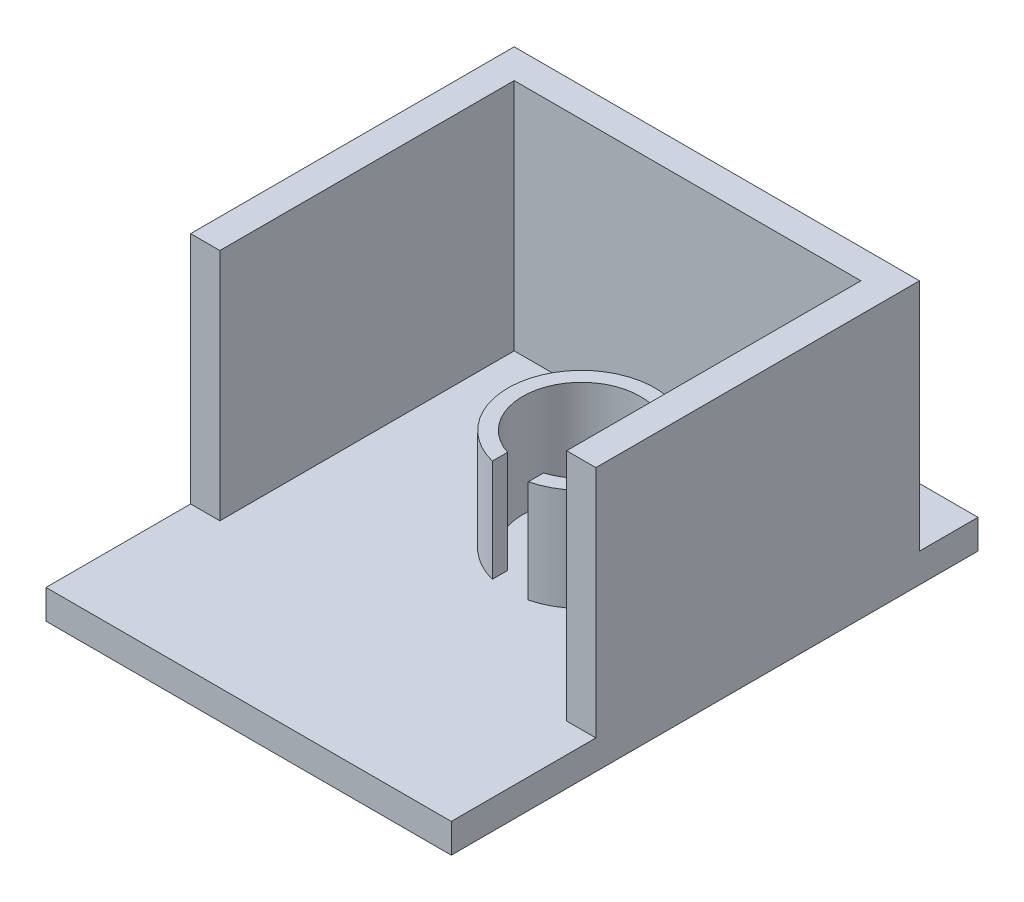
ISO-10303-21;
HEADER;
FILE_DESCRIPTION(('STEP AP214'),'2;1');
FILE_NAME('part.step','',(''),(''),'','','');
FILE_SCHEMA(('AUTOMOTIVE_DESIGN { 1 0 10303 214 1 1 1 1 }'));
ENDSEC;
DATA;
#1=APPLICATION_CONTEXT('core data for automotive mechanical design processes');
#2=APPLICATION_PROTOCOL_DEFINITION('international standard','automotive_design',2000,#1);
#3=PRODUCT_CONTEXT('',#1,'mechanical');
#4=PRODUCT('Part','Part','',(#3));
#5=PRODUCT_RELATED_PRODUCT_CATEGORY('part','',(#4));
#6=PRODUCT_DEFINITION_FORMATION('','',#4);
#7=PRODUCT_DEFINITION_CONTEXT('part definition',#1,'design');
#8=PRODUCT_DEFINITION('design','',#6,#7);
#9=PRODUCT_DEFINITION_SHAPE('','',#8);
#10=(LENGTH_UNIT() NAMED_UNIT(*) SI_UNIT(.MILLI.,.METRE.));
#11=(NAMED_UNIT(*) PLANE_ANGLE_UNIT() SI_UNIT($,.RADIAN.));
#12=(NAMED_UNIT(*) SI_UNIT($,.STERADIAN.) SOLID_ANGLE_UNIT());
#13=UNCERTAINTY_MEASURE_WITH_UNIT(LENGTH_MEASURE(1.E-05),#10,'distance_accuracy_value','');
#14=(GEOMETRIC_REPRESENTATION_CONTEXT(3) GLOBAL_UNCERTAINTY_ASSIGNED_CONTEXT((#13)) GLOBAL_UNIT_ASSIGNED_CONTEXT((#10,
#11,#12)) REPRESENTATION_CONTEXT('',''));
#15=CARTESIAN_POINT('',(0.,0.,0.));
#16=DIRECTION('',(0.,0.,1.));
#17=DIRECTION('',(1.,0.,0.));
#18=AXIS2_PLACEMENT_3D('',#15,#16,#17);
#19=CARTESIAN_POINT('',(0.,5.,0.));
#20=DIRECTION('',(0.,-1.,0.));
#21=DIRECTION('',(0.,0.,-1.));
#22=AXIS2_PLACEMENT_3D('',#19,#20,#21);
#23=PLANE('',#22);
#24=CARTESIAN_POINT('',(0.,5.,-23.));
#25=DIRECTION('',(0.,-1.,0.));
#26=DIRECTION('',(0.,0.,1.));
#27=AXIS2_PLACEMENT_3D('',#24,#25,#26);
#28=CIRCLE('',#27,20.1);
#29=CARTESIAN_POINT('',(-6.13516684592346,5.,-3.85921297927691));
#30=VERTEX_POINT('',#29);
#31=CARTESIAN_POINT('',(6.13516684592346,5.,-3.85921297927691));
#32=VERTEX_POINT('',#31);
#33=EDGE_CURVE('E204',#30,#32,#28,.T.);
#34=ORIENTED_EDGE('',*,*,#33,.F.);
#35=DIRECTION('',(0.,0.,-1.));
#36=VECTOR('',#35,1.);
#37=CARTESIAN_POINT('',(-6.13516684592346,5.,-3.85921297927691));
#38=LINE('',#37,#36);
#39=CARTESIAN_POINT('',(-6.13516684592346,5.,1.33864679419712));
#40=VERTEX_POINT('',#39);
#41=EDGE_CURVE('E194',#40,#30,#38,.T.);
#42=ORIENTED_EDGE('',*,*,#41,.F.);
#43=CARTESIAN_POINT('',(0.,5.,-23.));
#44=DIRECTION('',(0.,1.,0.));
#45=DIRECTION('',(0.,0.,1.));
#46=AXIS2_PLACEMENT_3D('',#43,#44,#45);
#47=CIRCLE('',#46,25.1);
#48=CARTESIAN_POINT('',(6.13516684592346,5.,1.33864679419712));
#49=VERTEX_POINT('',#48);
#50=EDGE_CURVE('E198',#49,#40,#47,.T.);
#51=ORIENTED_EDGE('',*,*,#50,.F.);
#52=DIRECTION('',(0.,0.,1.));
#53=VECTOR('',#52,1.);
#54=CARTESIAN_POINT('',(6.13516684592346,5.,-3.85921297927691));
#55=LINE('',#54,#53);
#56=EDGE_CURVE('E201',#32,#49,#55,.T.);
#57=ORIENTED_EDGE('',*,*,#56,.F.);
#58=EDGE_LOOP('',(#34,#42,#51,#57));
#59=FACE_BOUND('',#58,.T.);
#60=DIRECTION('',(1.,0.,0.));
#61=VECTOR('',#60,1.);
#62=CARTESIAN_POINT('',(-80.,5.,80.));
#63=LINE('',#62,#61);
#64=CARTESIAN_POINT('',(-80.,5.,80.));
#65=VERTEX_POINT('',#64);
#66=CARTESIAN_POINT('',(58.5,5.,80.));
#67=VERTEX_POINT('',#66);
#68=EDGE_CURVE('E176',#65,#67,#63,.T.);
#69=ORIENTED_EDGE('',*,*,#68,.T.);
#70=DIRECTION('',(0.,0.,1.));
#71=VECTOR('',#70,1.);
#72=CARTESIAN_POINT('',(58.5,5.,80.));
#73=LINE('',#72,#71);
#74=CARTESIAN_POINT('',(58.5,5.,30.5810382555309));
#75=VERTEX_POINT('',#74);
#76=EDGE_CURVE('E153',#75,#67,#73,.T.);
#77=ORIENTED_EDGE('',*,*,#76,.F.);
#78=DIRECTION('',(1.,0.,0.));
#79=VECTOR('',#78,1.);
#80=CARTESIAN_POINT('',(48.5,5.,30.5810382555309));
#81=LINE('',#80,#79);
#82=CARTESIAN_POINT('',(48.5,5.,30.5810382555309));
#83=VERTEX_POINT('',#82);
#84=EDGE_CURVE('E62',#83,#75,#81,.T.);
#85=ORIENTED_EDGE('',*,*,#84,.F.);
#86=DIRECTION('',(0.,0.,1.));
#87=VECTOR('',#86,1.);
#88=CARTESIAN_POINT('',(48.5,5.,-25.8269662482818));
#89=LINE('',#88,#87);
#90=CARTESIAN_POINT('',(48.5,5.,-70.));
#91=VERTEX_POINT('',#90);
#92=EDGE_CURVE('E243',#91,#83,#89,.T.);
#93=ORIENTED_EDGE('',*,*,#92,.F.);
#94=DIRECTION('',(1.,0.,0.));
#95=VECTOR('',#94,1.);
#96=CARTESIAN_POINT('',(-70.,5.,-70.));
#97=LINE('',#96,#95);
#98=CARTESIAN_POINT('',(-70.,5.,-70.));
#99=VERTEX_POINT('',#98);
#100=EDGE_CURVE('E245',#99,#91,#97,.T.);
#101=ORIENTED_EDGE('',*,*,#100,.F.);
#102=DIRECTION('',(0.,0.,-1.));
#103=VECTOR('',#102,1.);
#104=CARTESIAN_POINT('',(-70.,5.,-70.));
#105=LINE('',#104,#103);
#106=CARTESIAN_POINT('',(-70.,5.,30.5810382555309));
#107=VERTEX_POINT('',#106);
#108=EDGE_CURVE('E235',#107,#99,#105,.T.);
#109=ORIENTED_EDGE('',*,*,#108,.F.);
#110=DIRECTION('',(1.,0.,0.));
#111=VECTOR('',#110,1.);
#112=CARTESIAN_POINT('',(-70.,5.,30.5810382555309));
#113=LINE('',#112,#111);
#114=CARTESIAN_POINT('',(-80.,5.,30.5810382555309));
#115=VERTEX_POINT('',#114);
#116=EDGE_CURVE('E239',#115,#107,#113,.T.);
#117=ORIENTED_EDGE('',*,*,#116,.F.);
#118=DIRECTION('',(0.,0.,1.));
#119=VECTOR('',#118,1.);
#120=CARTESIAN_POINT('',(-80.,5.,80.));
#121=LINE('',#120,#119);
#122=EDGE_CURVE('E173',#115,#65,#121,.T.);
#123=ORIENTED_EDGE('',*,*,#122,.T.);
#124=EDGE_LOOP('',(#69,#77,#85,#93,#101,#109,#117,#123));
#125=FACE_BOUND('',#124,.T.);
#126=ADVANCED_FACE('F39',(#59,#125),#23,.F.);
#127=CARTESIAN_POINT('',(-80.,5.,-80.));
#128=DIRECTION('',(0.,0.,1.));
#129=DIRECTION('',(1.,0.,0.));
#130=AXIS2_PLACEMENT_3D('',#127,#128,#129);
#131=PLANE('',#130);
#132=DIRECTION('',(1.,0.,0.));
#133=VECTOR('',#132,1.);
#134=CARTESIAN_POINT('',(80.,5.,-80.));
#135=LINE('',#134,#133);
#136=CARTESIAN_POINT('',(-80.,5.,-80.));
#137=VERTEX_POINT('',#136);
#138=CARTESIAN_POINT('',(58.5,5.,-79.9999999999999));
#139=VERTEX_POINT('',#138);
#140=EDGE_CURVE('E158',#137,#139,#135,.T.);
#141=ORIENTED_EDGE('',*,*,#140,.F.);
#142=DIRECTION('',(0.,-1.,0.));
#143=VECTOR('',#142,1.);
#144=CARTESIAN_POINT('',(-80.,5.,-80.));
#145=LINE('',#144,#143);
#146=CARTESIAN_POINT('',(-80.,85.,-80.));
#147=VERTEX_POINT('',#146);
#148=EDGE_CURVE('E11',#147,#137,#145,.T.);
#149=ORIENTED_EDGE('',*,*,#148,.F.);
#150=DIRECTION('',(-1.,0.,0.));
#151=VECTOR('',#150,1.);
#152=CARTESIAN_POINT('',(58.5,85.,-80.));
#153=LINE('',#152,#151);
#154=CARTESIAN_POINT('',(58.5,85.,-80.));
#155=VERTEX_POINT('',#154);
#156=EDGE_CURVE('E254',#155,#147,#153,.T.);
#157=ORIENTED_EDGE('',*,*,#156,.F.);
#158=DIRECTION('',(0.,-1.,0.));
#159=VECTOR('',#158,1.);
#160=CARTESIAN_POINT('',(58.5,85.,-80.));
#161=LINE('',#160,#159);
#162=EDGE_CURVE('E222',#155,#139,#161,.T.);
#163=ORIENTED_EDGE('',*,*,#162,.T.);
#164=EDGE_LOOP('',(#141,#149,#157,#163));
#165=FACE_BOUND('',#164,.T.);
#166=ADVANCED_FACE('F41',(#165),#131,.F.);
#167=ORIENTED_EDGE('',*,*,#140,.T.);
#168=CARTESIAN_POINT('',(58.5,5.,-100.));
#169=VERTEX_POINT('',#168);
#170=EDGE_CURVE('E168',#169,#139,#73,.T.);
#171=ORIENTED_EDGE('',*,*,#170,.F.);
#172=DIRECTION('',(1.,0.,0.));
#173=VECTOR('',#172,1.);
#174=CARTESIAN_POINT('',(80.,5.,-100.));
#175=LINE('',#174,#173);
#176=CARTESIAN_POINT('',(-80.,5.,-100.));
#177=VERTEX_POINT('',#176);
#178=EDGE_CURVE('E266',#177,#169,#175,.T.);
#179=ORIENTED_EDGE('',*,*,#178,.F.);
#180=DIRECTION('',(0.,0.,1.));
#181=VECTOR('',#180,1.);
#182=CARTESIAN_POINT('',(-80.,5.,-100.));
#183=LINE('',#182,#181);
#184=EDGE_CURVE('E248',#177,#137,#183,.T.);
#185=ORIENTED_EDGE('',*,*,#184,.T.);
#186=EDGE_LOOP('',(#167,#171,#179,#185));
#187=FACE_BOUND('',#186,.T.);
#188=ADVANCED_FACE('F282',(#187),#23,.F.);
#189=CARTESIAN_POINT('',(-80.,5.,80.));
#190=DIRECTION('',(1.,0.,0.));
#191=DIRECTION('',(0.,0.,-1.));
#192=AXIS2_PLACEMENT_3D('',#189,#190,#191);
#193=PLANE('',#192);
#194=DIRECTION('',(0.,0.,1.));
#195=VECTOR('',#194,1.);
#196=CARTESIAN_POINT('',(-80.,-5.,80.));
#197=LINE('',#196,#195);
#198=CARTESIAN_POINT('',(-80.,-5.,-100.));
#199=VERTEX_POINT('',#198);
#200=CARTESIAN_POINT('',(-80.,-5.,80.));
#201=VERTEX_POINT('',#200);
#202=EDGE_CURVE('E174',#199,#201,#197,.T.);
#203=ORIENTED_EDGE('',*,*,#202,.T.);
#204=DIRECTION('',(0.,-1.,0.));
#205=VECTOR('',#204,1.);
#206=CARTESIAN_POINT('',(-80.,5.,80.));
#207=LINE('',#206,#205);
#208=EDGE_CURVE('E47',#65,#201,#207,.T.);
#209=ORIENTED_EDGE('',*,*,#208,.F.);
#210=ORIENTED_EDGE('',*,*,#122,.F.);
#211=DIRECTION('',(0.,-1.,0.));
#212=VECTOR('',#211,1.);
#213=CARTESIAN_POINT('',(-80.,85.,30.5810382555309));
#214=LINE('',#213,#212);
#215=CARTESIAN_POINT('',(-80.,85.,30.5810382555309));
#216=VERTEX_POINT('',#215);
#217=EDGE_CURVE('E225',#216,#115,#214,.T.);
#218=ORIENTED_EDGE('',*,*,#217,.F.);
#219=DIRECTION('',(0.,0.,1.));
#220=VECTOR('',#219,1.);
#221=CARTESIAN_POINT('',(-80.,85.,-80.));
#222=LINE('',#221,#220);
#223=EDGE_CURVE('E252',#147,#216,#222,.T.);
#224=ORIENTED_EDGE('',*,*,#223,.F.);
#225=ORIENTED_EDGE('',*,*,#148,.T.);
#226=ORIENTED_EDGE('',*,*,#184,.F.);
#227=DIRECTION('',(0.,1.,0.));
#228=VECTOR('',#227,1.);
#229=CARTESIAN_POINT('',(-80.,5.,-100.));
#230=LINE('',#229,#228);
#231=EDGE_CURVE('E271',#199,#177,#230,.T.);
#232=ORIENTED_EDGE('',*,*,#231,.F.);
#233=EDGE_LOOP('',(#203,#209,#210,#218,#224,#225,#226,#232));
#234=FACE_BOUND('',#233,.T.);
#235=ADVANCED_FACE('F290',(#234),#193,.F.);
#236=CARTESIAN_POINT('',(-80.,5.,80.));
#237=DIRECTION('',(0.,0.,-1.));
#238=DIRECTION('',(-1.,0.,0.));
#239=AXIS2_PLACEMENT_3D('',#236,#237,#238);
#240=PLANE('',#239);
#241=DIRECTION('',(1.,0.,0.));
#242=VECTOR('',#241,1.);
#243=CARTESIAN_POINT('',(-80.,-5.,80.));
#244=LINE('',#243,#242);
#245=CARTESIAN_POINT('',(58.5,-5.,80.));
#246=VERTEX_POINT('',#245);
#247=EDGE_CURVE('E166',#201,#246,#244,.T.);
#248=ORIENTED_EDGE('',*,*,#247,.T.);
#249=DIRECTION('',(0.,1.,0.));
#250=VECTOR('',#249,1.);
#251=CARTESIAN_POINT('',(58.5,-5.,80.));
#252=LINE('',#251,#250);
#253=EDGE_CURVE('E150',#246,#67,#252,.T.);
#254=ORIENTED_EDGE('',*,*,#253,.T.);
#255=ORIENTED_EDGE('',*,*,#68,.F.);
#256=ORIENTED_EDGE('',*,*,#208,.T.);
#257=EDGE_LOOP('',(#248,#254,#255,#256));
#258=FACE_BOUND('',#257,.T.);
#259=ADVANCED_FACE('F171',(#258),#240,.F.);
#260=CARTESIAN_POINT('',(0.,-5.,0.));
#261=DIRECTION('',(0.,-1.,0.));
#262=DIRECTION('',(0.,0.,-1.));
#263=AXIS2_PLACEMENT_3D('',#260,#261,#262);
#264=PLANE('',#263);
#265=DIRECTION('',(0.,0.,1.));
#266=VECTOR('',#265,1.);
#267=CARTESIAN_POINT('',(58.5,-5.,80.));
#268=LINE('',#267,#266);
#269=CARTESIAN_POINT('',(58.5,-5.,-100.));
#270=VERTEX_POINT('',#269);
#271=EDGE_CURVE('E54',#270,#246,#268,.T.);
#272=ORIENTED_EDGE('',*,*,#271,.T.);
#273=ORIENTED_EDGE('',*,*,#247,.F.);
#274=ORIENTED_EDGE('',*,*,#202,.F.);
#275=DIRECTION('',(-1.,0.,0.));
#276=VECTOR('',#275,1.);
#277=CARTESIAN_POINT('',(80.,-5.,-100.));
#278=LINE('',#277,#276);
#279=EDGE_CURVE('E167',#270,#199,#278,.T.);
#280=ORIENTED_EDGE('',*,*,#279,.F.);
#281=EDGE_LOOP('',(#272,#273,#274,#280));
#282=FACE_BOUND('',#281,.T.);
#283=ADVANCED_FACE('F164',(#282),#264,.T.);
#284=CARTESIAN_POINT('',(0.,40.,-23.));
#285=DIRECTION('',(0.,-1.,0.));
#286=DIRECTION('',(0.,0.,-1.));
#287=AXIS2_PLACEMENT_3D('',#284,#285,#286);
#288=CYLINDRICAL_SURFACE('',#287,20.1);
#289=ORIENTED_EDGE('',*,*,#33,.T.);
#290=DIRECTION('',(0.,-1.,0.));
#291=VECTOR('',#290,1.);
#292=CARTESIAN_POINT('',(6.13516684592346,40.,-3.85921297927691));
#293=LINE('',#292,#291);
#294=CARTESIAN_POINT('',(6.13516684592346,40.,-3.85921297927691));
#295=VERTEX_POINT('',#294);
#296=EDGE_CURVE('E178',#295,#32,#293,.T.);
#297=ORIENTED_EDGE('',*,*,#296,.F.);
#298=CARTESIAN_POINT('',(0.,40.,-23.));
#299=DIRECTION('',(0.,-1.,0.));
#300=DIRECTION('',(0.,0.,1.));
#301=AXIS2_PLACEMENT_3D('',#298,#299,#300);
#302=CIRCLE('',#301,20.1);
#303=CARTESIAN_POINT('',(-6.13516684592346,40.,-3.85921297927691));
#304=VERTEX_POINT('',#303);
#305=EDGE_CURVE('E197',#304,#295,#302,.T.);
#306=ORIENTED_EDGE('',*,*,#305,.F.);
#307=DIRECTION('',(0.,-1.,0.));
#308=VECTOR('',#307,1.);
#309=CARTESIAN_POINT('',(-6.13516684592346,40.,-3.85921297927691));
#310=LINE('',#309,#308);
#311=EDGE_CURVE('E190',#304,#30,#310,.T.);
#312=ORIENTED_EDGE('',*,*,#311,.T.);
#313=EDGE_LOOP('',(#289,#297,#306,#312));
#314=FACE_BOUND('',#313,.T.);
#315=ADVANCED_FACE('F339',(#314),#288,.F.);
#316=CARTESIAN_POINT('',(6.13516684592346,40.,-3.85921297927691));
#317=DIRECTION('',(1.,0.,0.));
#318=DIRECTION('',(0.,0.,-1.));
#319=AXIS2_PLACEMENT_3D('',#316,#317,#318);
#320=PLANE('',#319);
#321=ORIENTED_EDGE('',*,*,#56,.T.);
#322=DIRECTION('',(0.,-1.,0.));
#323=VECTOR('',#322,1.);
#324=CARTESIAN_POINT('',(6.13516684592346,40.,1.33864679419712));
#325=LINE('',#324,#323);
#326=CARTESIAN_POINT('',(6.13516684592346,40.,1.33864679419712));
#327=VERTEX_POINT('',#326);
#328=EDGE_CURVE('E184',#327,#49,#325,.T.);
#329=ORIENTED_EDGE('',*,*,#328,.F.);
#330=DIRECTION('',(0.,0.,1.));
#331=VECTOR('',#330,1.);
#332=CARTESIAN_POINT('',(6.13516684592346,40.,-3.85921297927691));
#333=LINE('',#332,#331);
#334=EDGE_CURVE('E211',#295,#327,#333,.T.);
#335=ORIENTED_EDGE('',*,*,#334,.F.);
#336=ORIENTED_EDGE('',*,*,#296,.T.);
#337=EDGE_LOOP('',(#321,#329,#335,#336));
#338=FACE_BOUND('',#337,.T.);
#339=ADVANCED_FACE('F342',(#338),#320,.F.);
#340=CARTESIAN_POINT('',(0.,40.,-23.));
#341=DIRECTION('',(0.,-1.,0.));
#342=DIRECTION('',(0.,0.,-1.));
#343=AXIS2_PLACEMENT_3D('',#340,#341,#342);
#344=CYLINDRICAL_SURFACE('',#343,25.1);
#345=ORIENTED_EDGE('',*,*,#50,.T.);
#346=DIRECTION('',(0.,-1.,0.));
#347=VECTOR('',#346,1.);
#348=CARTESIAN_POINT('',(-6.13516684592346,40.,1.33864679419712));
#349=LINE('',#348,#347);
#350=CARTESIAN_POINT('',(-6.13516684592346,40.,1.33864679419712));
#351=VERTEX_POINT('',#350);
#352=EDGE_CURVE('E187',#351,#40,#349,.T.);
#353=ORIENTED_EDGE('',*,*,#352,.F.);
#354=CARTESIAN_POINT('',(0.,40.,-23.));
#355=DIRECTION('',(0.,1.,0.));
#356=DIRECTION('',(0.,0.,1.));
#357=AXIS2_PLACEMENT_3D('',#354,#355,#356);
#358=CIRCLE('',#357,25.1);
#359=EDGE_CURVE('E209',#327,#351,#358,.T.);
#360=ORIENTED_EDGE('',*,*,#359,.F.);
#361=ORIENTED_EDGE('',*,*,#328,.T.);
#362=EDGE_LOOP('',(#345,#353,#360,#361));
#363=FACE_BOUND('',#362,.T.);
#364=ADVANCED_FACE('F348',(#363),#344,.T.);
#365=CARTESIAN_POINT('',(-6.13516684592346,40.,-3.85921297927691));
#366=DIRECTION('',(-1.,0.,0.));
#367=DIRECTION('',(0.,0.,1.));
#368=AXIS2_PLACEMENT_3D('',#365,#366,#367);
#369=PLANE('',#368);
#370=ORIENTED_EDGE('',*,*,#41,.T.);
#371=ORIENTED_EDGE('',*,*,#311,.F.);
#372=DIRECTION('',(0.,0.,-1.));
#373=VECTOR('',#372,1.);
#374=CARTESIAN_POINT('',(-6.13516684592346,40.,-3.85921297927691));
#375=LINE('',#374,#373);
#376=EDGE_CURVE('E193',#351,#304,#375,.T.);
#377=ORIENTED_EDGE('',*,*,#376,.F.);
#378=ORIENTED_EDGE('',*,*,#352,.T.);
#379=EDGE_LOOP('',(#370,#371,#377,#378));
#380=FACE_BOUND('',#379,.T.);
#381=ADVANCED_FACE('F354',(#380),#369,.F.);
#382=CARTESIAN_POINT('',(0.,40.,-23.));
#383=DIRECTION('',(0.,1.,0.));
#384=DIRECTION('',(0.,0.,1.));
#385=AXIS2_PLACEMENT_3D('',#382,#383,#384);
#386=PLANE('',#385);
#387=ORIENTED_EDGE('',*,*,#305,.T.);
#388=ORIENTED_EDGE('',*,*,#334,.T.);
#389=ORIENTED_EDGE('',*,*,#359,.T.);
#390=ORIENTED_EDGE('',*,*,#376,.T.);
#391=EDGE_LOOP('',(#387,#388,#389,#390));
#392=FACE_BOUND('',#391,.T.);
#393=ADVANCED_FACE('F358',(#392),#386,.T.);
#394=CARTESIAN_POINT('',(-70.,85.,-70.));
#395=DIRECTION('',(0.,0.,-1.));
#396=DIRECTION('',(-1.,0.,0.));
#397=AXIS2_PLACEMENT_3D('',#394,#395,#396);
#398=PLANE('',#397);
#399=ORIENTED_EDGE('',*,*,#100,.T.);
#400=DIRECTION('',(0.,-1.,0.));
#401=VECTOR('',#400,1.);
#402=CARTESIAN_POINT('',(48.5,85.,-70.));
#403=LINE('',#402,#401);
#404=CARTESIAN_POINT('',(48.5,85.,-70.));
#405=VERTEX_POINT('',#404);
#406=EDGE_CURVE('E207',#405,#91,#403,.T.);
#407=ORIENTED_EDGE('',*,*,#406,.F.);
#408=DIRECTION('',(1.,0.,0.));
#409=VECTOR('',#408,1.);
#410=CARTESIAN_POINT('',(-70.,85.,-70.));
#411=LINE('',#410,#409);
#412=CARTESIAN_POINT('',(-70.,85.,-70.));
#413=VERTEX_POINT('',#412);
#414=EDGE_CURVE('E238',#413,#405,#411,.T.);
#415=ORIENTED_EDGE('',*,*,#414,.F.);
#416=DIRECTION('',(0.,-1.,0.));
#417=VECTOR('',#416,1.);
#418=CARTESIAN_POINT('',(-70.,85.,-70.));
#419=LINE('',#418,#417);
#420=EDGE_CURVE('E231',#413,#99,#419,.T.);
#421=ORIENTED_EDGE('',*,*,#420,.T.);
#422=EDGE_LOOP('',(#399,#407,#415,#421));
#423=FACE_BOUND('',#422,.T.);
#424=ADVANCED_FACE('F303',(#423),#398,.F.);
#425=CARTESIAN_POINT('',(48.5,85.,-25.8269662482818));
#426=DIRECTION('',(1.,0.,0.));
#427=DIRECTION('',(0.,0.,-1.));
#428=AXIS2_PLACEMENT_3D('',#425,#426,#427);
#429=PLANE('',#428);
#430=ORIENTED_EDGE('',*,*,#92,.T.);
#431=DIRECTION('',(0.,-1.,0.));
#432=VECTOR('',#431,1.);
#433=CARTESIAN_POINT('',(48.5,85.,30.5810382555309));
#434=LINE('',#433,#432);
#435=CARTESIAN_POINT('',(48.5,85.,30.5810382555309));
#436=VERTEX_POINT('',#435);
#437=EDGE_CURVE('E217',#436,#83,#434,.T.);
#438=ORIENTED_EDGE('',*,*,#437,.F.);
#439=DIRECTION('',(0.,0.,1.));
#440=VECTOR('',#439,1.);
#441=CARTESIAN_POINT('',(48.5,85.,-70.));
#442=LINE('',#441,#440);
#443=EDGE_CURVE('E261',#405,#436,#442,.T.);
#444=ORIENTED_EDGE('',*,*,#443,.F.);
#445=ORIENTED_EDGE('',*,*,#406,.T.);
#446=EDGE_LOOP('',(#430,#438,#444,#445));
#447=FACE_BOUND('',#446,.T.);
#448=ADVANCED_FACE('F305',(#447),#429,.F.);
#449=CARTESIAN_POINT('',(48.5,85.,30.5810382555309));
#450=DIRECTION('',(0.,0.,-1.));
#451=DIRECTION('',(-1.,0.,0.));
#452=AXIS2_PLACEMENT_3D('',#449,#450,#451);
#453=PLANE('',#452);
#454=ORIENTED_EDGE('',*,*,#84,.T.);
#455=DIRECTION('',(0.,-1.,0.));
#456=VECTOR('',#455,1.);
#457=CARTESIAN_POINT('',(58.5,85.,30.5810382555309));
#458=LINE('',#457,#456);
#459=CARTESIAN_POINT('',(58.5,85.,30.5810382555309));
#460=VERTEX_POINT('',#459);
#461=EDGE_CURVE('E220',#460,#75,#458,.T.);
#462=ORIENTED_EDGE('',*,*,#461,.F.);
#463=DIRECTION('',(1.,0.,0.));
#464=VECTOR('',#463,1.);
#465=CARTESIAN_POINT('',(48.5,85.,30.5810382555309));
#466=LINE('',#465,#464);
#467=EDGE_CURVE('E259',#436,#460,#466,.T.);
#468=ORIENTED_EDGE('',*,*,#467,.F.);
#469=ORIENTED_EDGE('',*,*,#437,.T.);
#470=EDGE_LOOP('',(#454,#462,#468,#469));
#471=FACE_BOUND('',#470,.T.);
#472=ADVANCED_FACE('F310',(#471),#453,.F.);
#473=CARTESIAN_POINT('',(58.5,85.,-74.));
#474=DIRECTION('',(-1.,0.,0.));
#475=DIRECTION('',(0.,0.,1.));
#476=AXIS2_PLACEMENT_3D('',#473,#474,#475);
#477=PLANE('',#476);
#478=ORIENTED_EDGE('',*,*,#461,.T.);
#479=ORIENTED_EDGE('',*,*,#76,.T.);
#480=ORIENTED_EDGE('',*,*,#253,.F.);
#481=ORIENTED_EDGE('',*,*,#271,.F.);
#482=DIRECTION('',(0.,1.,0.));
#483=VECTOR('',#482,1.);
#484=CARTESIAN_POINT('',(58.5,-5.,-100.));
#485=LINE('',#484,#483);
#486=EDGE_CURVE('E159',#270,#169,#485,.T.);
#487=ORIENTED_EDGE('',*,*,#486,.T.);
#488=ORIENTED_EDGE('',*,*,#170,.T.);
#489=ORIENTED_EDGE('',*,*,#162,.F.);
#490=DIRECTION('',(0.,0.,-1.));
#491=VECTOR('',#490,1.);
#492=CARTESIAN_POINT('',(58.5,85.,-25.8269662482818));
#493=LINE('',#492,#491);
#494=EDGE_CURVE('E257',#460,#155,#493,.T.);
#495=ORIENTED_EDGE('',*,*,#494,.F.);
#496=EDGE_LOOP('',(#478,#479,#480,#481,#487,#488,#489,#495));
#497=FACE_BOUND('',#496,.T.);
#498=ADVANCED_FACE('F152',(#497),#477,.F.);
#499=CARTESIAN_POINT('',(-70.,85.,30.5810382555309));
#500=DIRECTION('',(0.,0.,-1.));
#501=DIRECTION('',(-1.,0.,0.));
#502=AXIS2_PLACEMENT_3D('',#499,#500,#501);
#503=PLANE('',#502);
#504=ORIENTED_EDGE('',*,*,#116,.T.);
#505=DIRECTION('',(0.,-1.,0.));
#506=VECTOR('',#505,1.);
#507=CARTESIAN_POINT('',(-70.,85.,30.5810382555309));
#508=LINE('',#507,#506);
#509=CARTESIAN_POINT('',(-70.,85.,30.5810382555309));
#510=VERTEX_POINT('',#509);
#511=EDGE_CURVE('E228',#510,#107,#508,.T.);
#512=ORIENTED_EDGE('',*,*,#511,.F.);
#513=DIRECTION('',(1.,0.,0.));
#514=VECTOR('',#513,1.);
#515=CARTESIAN_POINT('',(-70.,85.,30.5810382555309));
#516=LINE('',#515,#514);
#517=EDGE_CURVE('E250',#216,#510,#516,.T.);
#518=ORIENTED_EDGE('',*,*,#517,.F.);
#519=ORIENTED_EDGE('',*,*,#217,.T.);
#520=EDGE_LOOP('',(#504,#512,#518,#519));
#521=FACE_BOUND('',#520,.T.);
#522=ADVANCED_FACE('F295',(#521),#503,.F.);
#523=CARTESIAN_POINT('',(-70.,85.,-70.));
#524=DIRECTION('',(-1.,0.,0.));
#525=DIRECTION('',(0.,0.,1.));
#526=AXIS2_PLACEMENT_3D('',#523,#524,#525);
#527=PLANE('',#526);
#528=ORIENTED_EDGE('',*,*,#108,.T.);
#529=ORIENTED_EDGE('',*,*,#420,.F.);
#530=DIRECTION('',(0.,0.,-1.));
#531=VECTOR('',#530,1.);
#532=CARTESIAN_POINT('',(-70.,85.,-70.));
#533=LINE('',#532,#531);
#534=EDGE_CURVE('E234',#510,#413,#533,.T.);
#535=ORIENTED_EDGE('',*,*,#534,.F.);
#536=ORIENTED_EDGE('',*,*,#511,.T.);
#537=EDGE_LOOP('',(#528,#529,#535,#536));
#538=FACE_BOUND('',#537,.T.);
#539=ADVANCED_FACE('F301',(#538),#527,.F.);
#540=CARTESIAN_POINT('',(0.,85.,0.));
#541=DIRECTION('',(0.,-1.,0.));
#542=DIRECTION('',(0.,0.,-1.));
#543=AXIS2_PLACEMENT_3D('',#540,#541,#542);
#544=PLANE('',#543);
#545=ORIENTED_EDGE('',*,*,#414,.T.);
#546=ORIENTED_EDGE('',*,*,#443,.T.);
#547=ORIENTED_EDGE('',*,*,#467,.T.);
#548=ORIENTED_EDGE('',*,*,#494,.T.);
#549=ORIENTED_EDGE('',*,*,#156,.T.);
#550=ORIENTED_EDGE('',*,*,#223,.T.);
#551=ORIENTED_EDGE('',*,*,#517,.T.);
#552=ORIENTED_EDGE('',*,*,#534,.T.);
#553=EDGE_LOOP('',(#545,#546,#547,#548,#549,#550,#551,#552));
#554=FACE_BOUND('',#553,.T.);
#555=ADVANCED_FACE('F287',(#554),#544,.F.);
#556=CARTESIAN_POINT('',(0.,0.,-100.));
#557=DIRECTION('',(0.,0.,-1.));
#558=DIRECTION('',(-1.,0.,0.));
#559=AXIS2_PLACEMENT_3D('',#556,#557,#558);
#560=PLANE('',#559);
#561=ORIENTED_EDGE('',*,*,#486,.F.);
#562=ORIENTED_EDGE('',*,*,#279,.T.);
#563=ORIENTED_EDGE('',*,*,#231,.T.);
#564=ORIENTED_EDGE('',*,*,#178,.T.);
#565=EDGE_LOOP('',(#561,#562,#563,#564));
#566=FACE_BOUND('',#565,.T.);
#567=ADVANCED_FACE('F395',(#566),#560,.T.);
#568=CLOSED_SHELL('',(#126,#166,#188,#235,#259,#283,#315,#339,#364,#381,#393,#424,#448,#472,
#498,#522,#539,#555,#567));
#569=MANIFOLD_SOLID_BREP('B2',#568);
#570=ADVANCED_BREP_SHAPE_REPRESENTATION('',(#18,#569),#14);
#571=SHAPE_DEFINITION_REPRESENTATION(#9,#570);
ENDSEC;
END-ISO-10303-21;
